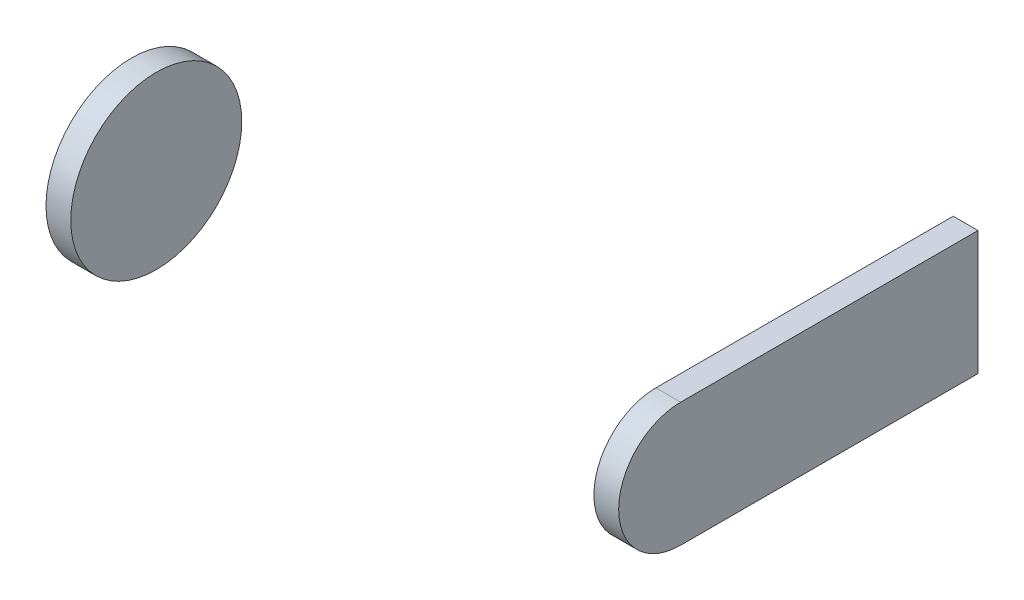
ISO-10303-21;
HEADER;
FILE_DESCRIPTION(('STEP AP214'),'2;1');
FILE_NAME('part.step','',(''),(''),'','','');
FILE_SCHEMA(('AUTOMOTIVE_DESIGN { 1 0 10303 214 1 1 1 1 }'));
ENDSEC;
DATA;
#1=APPLICATION_CONTEXT('core data for automotive mechanical design processes');
#2=APPLICATION_PROTOCOL_DEFINITION('international standard','automotive_design',2000,#1);
#3=PRODUCT_CONTEXT('',#1,'mechanical');
#4=PRODUCT('Part','Part','',(#3));
#5=PRODUCT_RELATED_PRODUCT_CATEGORY('part','',(#4));
#6=PRODUCT_DEFINITION_FORMATION('','',#4);
#7=PRODUCT_DEFINITION_CONTEXT('part definition',#1,'design');
#8=PRODUCT_DEFINITION('design','',#6,#7);
#9=PRODUCT_DEFINITION_SHAPE('','',#8);
#10=(LENGTH_UNIT() NAMED_UNIT(*) SI_UNIT(.MILLI.,.METRE.));
#11=(NAMED_UNIT(*) PLANE_ANGLE_UNIT() SI_UNIT($,.RADIAN.));
#12=(NAMED_UNIT(*) SI_UNIT($,.STERADIAN.) SOLID_ANGLE_UNIT());
#13=UNCERTAINTY_MEASURE_WITH_UNIT(LENGTH_MEASURE(1.E-05),#10,'distance_accuracy_value','');
#14=(GEOMETRIC_REPRESENTATION_CONTEXT(3) GLOBAL_UNCERTAINTY_ASSIGNED_CONTEXT((#13)) GLOBAL_UNIT_ASSIGNED_CONTEXT((#10,
#11,#12)) REPRESENTATION_CONTEXT('',''));
#15=CARTESIAN_POINT('',(0.,0.,0.));
#16=DIRECTION('',(0.,0.,1.));
#17=DIRECTION('',(1.,0.,0.));
#18=AXIS2_PLACEMENT_3D('',#15,#16,#17);
#19=CARTESIAN_POINT('',(75.002341733152,32.2774748594882,55.7761290990576));
#20=DIRECTION('',(-1.,0.,0.));
#21=DIRECTION('',(0.,-1.,0.));
#22=AXIS2_PLACEMENT_3D('',#19,#20,#21);
#23=CYLINDRICAL_SURFACE('',#22,12.5);
#24=CARTESIAN_POINT('',(75.002341733152,32.2774748594882,55.7761290990576));
#25=DIRECTION('',(1.,0.,0.));
#26=DIRECTION('',(0.,1.,0.));
#27=AXIS2_PLACEMENT_3D('',#24,#25,#26);
#28=CIRCLE('',#27,12.5);
#29=CARTESIAN_POINT('',(75.002341733152,44.7774748594882,55.7761290990576));
#30=VERTEX_POINT('',#29);
#31=CARTESIAN_POINT('',(75.002341733152,19.7774748594882,55.7761290990576));
#32=VERTEX_POINT('',#31);
#33=EDGE_CURVE('E56',#30,#32,#28,.T.);
#34=ORIENTED_EDGE('',*,*,#33,.F.);
#35=DIRECTION('',(1.,0.,0.));
#36=VECTOR('',#35,1.);
#37=CARTESIAN_POINT('',(70.002341733152,44.7774748594882,55.7761290990576));
#38=LINE('',#37,#36);
#39=CARTESIAN_POINT('',(70.002341733152,44.7774748594882,55.7761290990576));
#40=VERTEX_POINT('',#39);
#41=EDGE_CURVE('E125',#40,#30,#38,.T.);
#42=ORIENTED_EDGE('',*,*,#41,.F.);
#43=CARTESIAN_POINT('',(70.002341733152,32.2774748594882,55.7761290990576));
#44=DIRECTION('',(1.,0.,0.));
#45=DIRECTION('',(0.,1.,0.));
#46=AXIS2_PLACEMENT_3D('',#43,#44,#45);
#47=CIRCLE('',#46,12.5);
#48=CARTESIAN_POINT('',(70.002341733152,19.7774748594882,55.7761290990576));
#49=VERTEX_POINT('',#48);
#50=EDGE_CURVE('E136',#40,#49,#47,.T.);
#51=ORIENTED_EDGE('',*,*,#50,.T.);
#52=DIRECTION('',(1.,0.,0.));
#53=VECTOR('',#52,1.);
#54=CARTESIAN_POINT('',(70.002341733152,19.7774748594882,55.7761290990576));
#55=LINE('',#54,#53);
#56=EDGE_CURVE('E94',#49,#32,#55,.T.);
#57=ORIENTED_EDGE('',*,*,#56,.T.);
#58=EDGE_LOOP('',(#34,#42,#51,#57));
#59=FACE_BOUND('',#58,.T.);
#60=ADVANCED_FACE('F47',(#59),#23,.T.);
#61=CARTESIAN_POINT('',(75.002341733152,32.2774748594882,55.7761290990576));
#62=DIRECTION('',(1.,0.,0.));
#63=DIRECTION('',(0.,1.,0.));
#64=AXIS2_PLACEMENT_3D('',#61,#62,#63);
#65=PLANE('',#64);
#66=ORIENTED_EDGE('',*,*,#33,.T.);
#67=DIRECTION('',(0.,0.,-1.));
#68=VECTOR('',#67,1.);
#69=CARTESIAN_POINT('',(75.002341733152,19.7774748594882,-4.22387090094237));
#70=LINE('',#69,#68);
#71=CARTESIAN_POINT('',(75.002341733152,19.7774748594882,-4.22387090094237));
#72=VERTEX_POINT('',#71);
#73=EDGE_CURVE('E120',#32,#72,#70,.T.);
#74=ORIENTED_EDGE('',*,*,#73,.T.);
#75=DIRECTION('',(0.,1.,0.));
#76=VECTOR('',#75,1.);
#77=CARTESIAN_POINT('',(75.002341733152,44.7774748594882,-4.22387090094237));
#78=LINE('',#77,#76);
#79=CARTESIAN_POINT('',(75.002341733152,44.7774748594882,-4.22387090094237));
#80=VERTEX_POINT('',#79);
#81=EDGE_CURVE('E101',#72,#80,#78,.T.);
#82=ORIENTED_EDGE('',*,*,#81,.T.);
#83=DIRECTION('',(0.,0.,1.));
#84=VECTOR('',#83,1.);
#85=CARTESIAN_POINT('',(75.002341733152,44.7774748594882,55.7761290990576));
#86=LINE('',#85,#84);
#87=EDGE_CURVE('E63',#80,#30,#86,.T.);
#88=ORIENTED_EDGE('',*,*,#87,.T.);
#89=EDGE_LOOP('',(#66,#74,#82,#88));
#90=FACE_BOUND('',#89,.T.);
#91=ADVANCED_FACE('F153',(#90),#65,.T.);
#92=CARTESIAN_POINT('',(70.002341733152,32.2774748594882,55.7761290990576));
#93=DIRECTION('',(1.,0.,0.));
#94=DIRECTION('',(0.,1.,0.));
#95=AXIS2_PLACEMENT_3D('',#92,#93,#94);
#96=PLANE('',#95);
#97=CARTESIAN_POINT('',(70.002341733152,32.2774748594882,55.7761290990576));
#98=DIRECTION('',(1.,0.,0.));
#99=DIRECTION('',(0.,1.,0.));
#100=AXIS2_PLACEMENT_3D('',#97,#98,#99);
#101=CIRCLE('',#100,8.57071421427142);
#102=CARTESIAN_POINT('',(70.002341733152,40.8481890737596,55.7761290990576));
#103=VERTEX_POINT('',#102);
#104=EDGE_CURVE('E12',#103,#103,#101,.T.);
#105=ORIENTED_EDGE('',*,*,#104,.T.);
#106=EDGE_LOOP('',(#105));
#107=FACE_BOUND('',#106,.T.);
#108=ORIENTED_EDGE('',*,*,#50,.F.);
#109=DIRECTION('',(0.,0.,1.));
#110=VECTOR('',#109,1.);
#111=CARTESIAN_POINT('',(70.002341733152,44.7774748594882,55.7761290990576));
#112=LINE('',#111,#110);
#113=CARTESIAN_POINT('',(70.002341733152,44.7774748594882,-4.22387090094237));
#114=VERTEX_POINT('',#113);
#115=EDGE_CURVE('E71',#114,#40,#112,.T.);
#116=ORIENTED_EDGE('',*,*,#115,.F.);
#117=DIRECTION('',(0.,1.,0.));
#118=VECTOR('',#117,1.);
#119=CARTESIAN_POINT('',(70.002341733152,44.7774748594882,-4.22387090094237));
#120=LINE('',#119,#118);
#121=CARTESIAN_POINT('',(70.002341733152,19.7774748594882,-4.22387090094237));
#122=VERTEX_POINT('',#121);
#123=EDGE_CURVE('E100',#122,#114,#120,.T.);
#124=ORIENTED_EDGE('',*,*,#123,.F.);
#125=DIRECTION('',(0.,0.,-1.));
#126=VECTOR('',#125,1.);
#127=CARTESIAN_POINT('',(70.002341733152,19.7774748594882,-4.22387090094237));
#128=LINE('',#127,#126);
#129=EDGE_CURVE('E108',#49,#122,#128,.T.);
#130=ORIENTED_EDGE('',*,*,#129,.F.);
#131=EDGE_LOOP('',(#108,#116,#124,#130));
#132=FACE_BOUND('',#131,.T.);
#133=ADVANCED_FACE('F107',(#107,#132),#96,.F.);
#134=CARTESIAN_POINT('',(68.502341733152,32.2774748594882,55.7761290990576));
#135=DIRECTION('',(-1.,0.,0.));
#136=DIRECTION('',(0.,-1.,0.));
#137=AXIS2_PLACEMENT_3D('',#134,#135,#136);
#138=PLANE('',#137);
#139=CARTESIAN_POINT('',(68.502341733152,32.2774748594882,55.7761290990576));
#140=DIRECTION('',(-1.,0.,0.));
#141=DIRECTION('',(0.,-1.,0.));
#142=AXIS2_PLACEMENT_3D('',#139,#140,#141);
#143=CIRCLE('',#142,5.);
#144=CARTESIAN_POINT('',(68.502341733152,27.2774748594882,55.7761290990576));
#145=VERTEX_POINT('',#144);
#146=EDGE_CURVE('E128',#145,#145,#143,.T.);
#147=ORIENTED_EDGE('',*,*,#146,.T.);
#148=EDGE_LOOP('',(#147));
#149=FACE_BOUND('',#148,.T.);
#150=ADVANCED_FACE('F150',(#149),#138,.T.);
#151=CARTESIAN_POINT('',(65.002341733152,32.2774748594882,55.7761290990576));
#152=DIRECTION('',(1.,0.,0.));
#153=DIRECTION('',(0.,1.,0.));
#154=AXIS2_PLACEMENT_3D('',#151,#152,#153);
#155=TOROIDAL_SURFACE('',#154,8.57071421427142,5.);
#156=ORIENTED_EDGE('',*,*,#104,.F.);
#157=EDGE_LOOP('',(#156));
#158=FACE_BOUND('',#157,.T.);
#159=ORIENTED_EDGE('',*,*,#146,.F.);
#160=EDGE_LOOP('',(#159));
#161=FACE_BOUND('',#160,.T.);
#162=ADVANCED_FACE('F49',(#158,#161),#155,.F.);
#163=CARTESIAN_POINT('',(70.002341733152,44.7774748594882,55.7761290990576));
#164=DIRECTION('',(0.,1.,0.));
#165=DIRECTION('',(-1.,0.,0.));
#166=AXIS2_PLACEMENT_3D('',#163,#164,#165);
#167=PLANE('',#166);
#168=ORIENTED_EDGE('',*,*,#87,.F.);
#169=DIRECTION('',(1.,0.,0.));
#170=VECTOR('',#169,1.);
#171=CARTESIAN_POINT('',(70.002341733152,44.7774748594882,-4.22387090094237));
#172=LINE('',#171,#170);
#173=EDGE_CURVE('E88',#114,#80,#172,.T.);
#174=ORIENTED_EDGE('',*,*,#173,.F.);
#175=ORIENTED_EDGE('',*,*,#115,.T.);
#176=ORIENTED_EDGE('',*,*,#41,.T.);
#177=EDGE_LOOP('',(#168,#174,#175,#176));
#178=FACE_BOUND('',#177,.T.);
#179=ADVANCED_FACE('F141',(#178),#167,.T.);
#180=CARTESIAN_POINT('',(70.002341733152,44.7774748594882,-4.22387090094237));
#181=DIRECTION('',(0.,0.,-1.));
#182=DIRECTION('',(0.,1.,0.));
#183=AXIS2_PLACEMENT_3D('',#180,#181,#182);
#184=PLANE('',#183);
#185=ORIENTED_EDGE('',*,*,#81,.F.);
#186=DIRECTION('',(1.,0.,0.));
#187=VECTOR('',#186,1.);
#188=CARTESIAN_POINT('',(70.002341733152,19.7774748594882,-4.22387090094237));
#189=LINE('',#188,#187);
#190=EDGE_CURVE('E97',#122,#72,#189,.T.);
#191=ORIENTED_EDGE('',*,*,#190,.F.);
#192=ORIENTED_EDGE('',*,*,#123,.T.);
#193=ORIENTED_EDGE('',*,*,#173,.T.);
#194=EDGE_LOOP('',(#185,#191,#192,#193));
#195=FACE_BOUND('',#194,.T.);
#196=ADVANCED_FACE('F99',(#195),#184,.T.);
#197=CARTESIAN_POINT('',(70.002341733152,19.7774748594882,-4.22387090094237));
#198=DIRECTION('',(0.,-1.,0.));
#199=DIRECTION('',(1.,0.,0.));
#200=AXIS2_PLACEMENT_3D('',#197,#198,#199);
#201=PLANE('',#200);
#202=ORIENTED_EDGE('',*,*,#73,.F.);
#203=ORIENTED_EDGE('',*,*,#56,.F.);
#204=ORIENTED_EDGE('',*,*,#129,.T.);
#205=ORIENTED_EDGE('',*,*,#190,.T.);
#206=EDGE_LOOP('',(#202,#203,#204,#205));
#207=FACE_BOUND('',#206,.T.);
#208=ADVANCED_FACE('F112',(#207),#201,.T.);
#209=CLOSED_SHELL('',(#60,#91,#133,#150,#162,#179,#196,#208));
#210=MANIFOLD_SOLID_BREP('B2',#209);
#211=CARTESIAN_POINT('',(-35.797658266848,32.2774748594882,55.7761290990576));
#212=DIRECTION('',(1.,0.,0.));
#213=DIRECTION('',(0.,0.,-1.));
#214=AXIS2_PLACEMENT_3D('',#211,#212,#213);
#215=CYLINDRICAL_SURFACE('',#214,17.25);
#216=CARTESIAN_POINT('',(-35.797658266848,32.2774748594882,55.7761290990576));
#217=DIRECTION('',(-1.,0.,0.));
#218=DIRECTION('',(0.,0.,1.));
#219=AXIS2_PLACEMENT_3D('',#216,#217,#218);
#220=CIRCLE('',#219,17.25);
#221=CARTESIAN_POINT('',(-35.797658266848,32.2774748594882,73.0261290990576));
#222=VERTEX_POINT('',#221);
#223=EDGE_CURVE('E46',#222,#222,#220,.T.);
#224=ORIENTED_EDGE('',*,*,#223,.F.);
#225=EDGE_LOOP('',(#224));
#226=FACE_BOUND('',#225,.T.);
#227=CARTESIAN_POINT('',(-30.797658266848,32.2774748594882,55.7761290990576));
#228=DIRECTION('',(-1.,0.,0.));
#229=DIRECTION('',(0.,0.,1.));
#230=AXIS2_PLACEMENT_3D('',#227,#228,#229);
#231=CIRCLE('',#230,17.25);
#232=CARTESIAN_POINT('',(-30.797658266848,32.2774748594882,73.0261290990576));
#233=VERTEX_POINT('',#232);
#234=EDGE_CURVE('E223',#233,#233,#231,.T.);
#235=ORIENTED_EDGE('',*,*,#234,.T.);
#236=EDGE_LOOP('',(#235));
#237=FACE_BOUND('',#236,.T.);
#238=ADVANCED_FACE('F220',(#226,#237),#215,.T.);
#239=CARTESIAN_POINT('',(-35.797658266848,32.2774748594882,55.7761290990576));
#240=DIRECTION('',(-1.,0.,0.));
#241=DIRECTION('',(0.,0.,1.));
#242=AXIS2_PLACEMENT_3D('',#239,#240,#241);
#243=PLANE('',#242);
#244=ORIENTED_EDGE('',*,*,#223,.T.);
#245=EDGE_LOOP('',(#244));
#246=FACE_BOUND('',#245,.T.);
#247=ADVANCED_FACE('F235',(#246),#243,.T.);
#248=CARTESIAN_POINT('',(-30.797658266848,32.2774748594882,55.7761290990576));
#249=DIRECTION('',(-1.,0.,0.));
#250=DIRECTION('',(0.,0.,1.));
#251=AXIS2_PLACEMENT_3D('',#248,#249,#250);
#252=PLANE('',#251);
#253=ORIENTED_EDGE('',*,*,#234,.F.);
#254=EDGE_LOOP('',(#253));
#255=FACE_BOUND('',#254,.T.);
#256=ADVANCED_FACE('F233',(#255),#252,.F.);
#257=CLOSED_SHELL('',(#238,#247,#256));
#258=MANIFOLD_SOLID_BREP('B6',#257);
#259=ADVANCED_BREP_SHAPE_REPRESENTATION('',(#18,#210,#258),#14);
#260=SHAPE_DEFINITION_REPRESENTATION(#9,#259);
ENDSEC;
END-ISO-10303-21;
